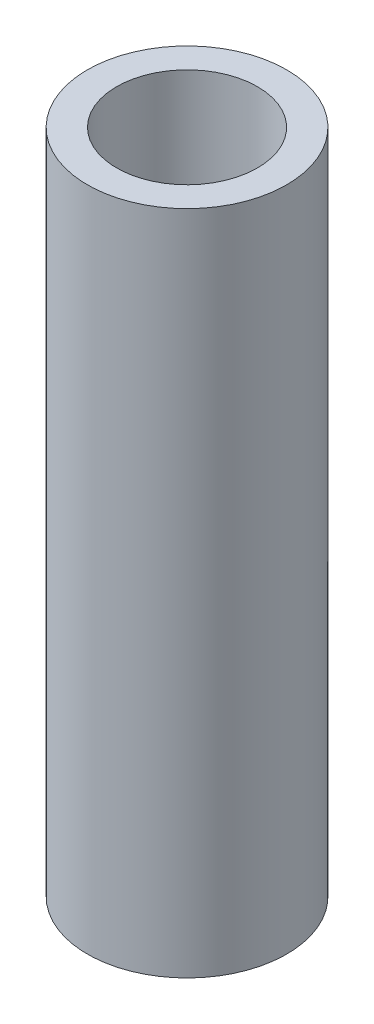
ISO-10303-21;
HEADER;
FILE_DESCRIPTION(('STEP AP214'),'2;1');
FILE_NAME('part.step','',(''),(''),'','','');
FILE_SCHEMA(('AUTOMOTIVE_DESIGN { 1 0 10303 214 1 1 1 1 }'));
ENDSEC;
DATA;
#1=APPLICATION_CONTEXT('core data for automotive mechanical design processes');
#2=APPLICATION_PROTOCOL_DEFINITION('international standard','automotive_design',2000,#1);
#3=PRODUCT_CONTEXT('',#1,'mechanical');
#4=PRODUCT('Part','Part','',(#3));
#5=PRODUCT_RELATED_PRODUCT_CATEGORY('part','',(#4));
#6=PRODUCT_DEFINITION_FORMATION('','',#4);
#7=PRODUCT_DEFINITION_CONTEXT('part definition',#1,'design');
#8=PRODUCT_DEFINITION('design','',#6,#7);
#9=PRODUCT_DEFINITION_SHAPE('','',#8);
#10=(LENGTH_UNIT() NAMED_UNIT(*) SI_UNIT(.MILLI.,.METRE.));
#11=(NAMED_UNIT(*) PLANE_ANGLE_UNIT() SI_UNIT($,.RADIAN.));
#12=(NAMED_UNIT(*) SI_UNIT($,.STERADIAN.) SOLID_ANGLE_UNIT());
#13=UNCERTAINTY_MEASURE_WITH_UNIT(LENGTH_MEASURE(1.E-05),#10,'distance_accuracy_value','');
#14=(GEOMETRIC_REPRESENTATION_CONTEXT(3) GLOBAL_UNCERTAINTY_ASSIGNED_CONTEXT((#13)) GLOBAL_UNIT_ASSIGNED_CONTEXT((#10,
#11,#12)) REPRESENTATION_CONTEXT('',''));
#15=CARTESIAN_POINT('',(0.,0.,0.));
#16=DIRECTION('',(0.,0.,1.));
#17=DIRECTION('',(1.,0.,0.));
#18=AXIS2_PLACEMENT_3D('',#15,#16,#17);
#19=CARTESIAN_POINT('',(0.,57.,0.));
#20=DIRECTION('',(0.,1.,0.));
#21=DIRECTION('',(0.,0.,1.));
#22=AXIS2_PLACEMENT_3D('',#19,#20,#21);
#23=PLANE('',#22);
#24=CARTESIAN_POINT('',(0.,57.,0.));
#25=DIRECTION('',(0.,1.,0.));
#26=DIRECTION('',(1.,0.,0.));
#27=AXIS2_PLACEMENT_3D('',#24,#25,#26);
#28=CIRCLE('',#27,8.525);
#29=CARTESIAN_POINT('',(0.,57.,-8.525));
#30=VERTEX_POINT('',#29);
#31=EDGE_CURVE('E11',#30,#30,#28,.T.);
#32=ORIENTED_EDGE('',*,*,#31,.T.);
#33=EDGE_LOOP('',(#32));
#34=FACE_BOUND('',#33,.T.);
#35=CARTESIAN_POINT('',(0.,57.,0.));
#36=DIRECTION('',(0.,1.,0.));
#37=DIRECTION('',(0.,0.,1.));
#38=AXIS2_PLACEMENT_3D('',#35,#36,#37);
#39=CIRCLE('',#38,6.025);
#40=CARTESIAN_POINT('',(0.,57.,-6.025));
#41=VERTEX_POINT('',#40);
#42=EDGE_CURVE('E62',#41,#41,#39,.T.);
#43=ORIENTED_EDGE('',*,*,#42,.F.);
#44=EDGE_LOOP('',(#43));
#45=FACE_BOUND('',#44,.T.);
#46=ADVANCED_FACE('F49',(#34,#45),#23,.T.);
#47=CARTESIAN_POINT('',(0.,0.,0.));
#48=DIRECTION('',(0.,1.,0.));
#49=DIRECTION('',(0.,0.,1.));
#50=AXIS2_PLACEMENT_3D('',#47,#48,#49);
#51=PLANE('',#50);
#52=CARTESIAN_POINT('',(0.,0.,0.));
#53=DIRECTION('',(0.,1.,0.));
#54=DIRECTION('',(1.,0.,0.));
#55=AXIS2_PLACEMENT_3D('',#52,#53,#54);
#56=CIRCLE('',#55,8.525);
#57=CARTESIAN_POINT('',(0.,0.,-8.525));
#58=VERTEX_POINT('',#57);
#59=EDGE_CURVE('E53',#58,#58,#56,.T.);
#60=ORIENTED_EDGE('',*,*,#59,.F.);
#61=EDGE_LOOP('',(#60));
#62=FACE_BOUND('',#61,.T.);
#63=CARTESIAN_POINT('',(0.,0.,0.));
#64=DIRECTION('',(0.,1.,0.));
#65=DIRECTION('',(0.,0.,1.));
#66=AXIS2_PLACEMENT_3D('',#63,#64,#65);
#67=CIRCLE('',#66,6.025);
#68=CARTESIAN_POINT('',(0.,0.,-6.025));
#69=VERTEX_POINT('',#68);
#70=EDGE_CURVE('E64',#69,#69,#67,.T.);
#71=ORIENTED_EDGE('',*,*,#70,.T.);
#72=EDGE_LOOP('',(#71));
#73=FACE_BOUND('',#72,.T.);
#74=ADVANCED_FACE('F76',(#62,#73),#51,.F.);
#75=CARTESIAN_POINT('',(0.,57.,0.));
#76=DIRECTION('',(0.,-1.,0.));
#77=DIRECTION('',(0.,0.,-1.));
#78=AXIS2_PLACEMENT_3D('',#75,#76,#77);
#79=CYLINDRICAL_SURFACE('',#78,8.525);
#80=CARTESIAN_POINT('',(0.,57.,-8.525));
#81=CARTESIAN_POINT('',(0.,56.40625,-8.525));
#82=CARTESIAN_POINT('',(0.,55.8125,-8.525));
#83=CARTESIAN_POINT('',(0.,54.625,-8.525));
#84=CARTESIAN_POINT('',(0.,54.03125,-8.525));
#85=CARTESIAN_POINT('',(0.,52.84375,-8.525));
#86=CARTESIAN_POINT('',(0.,52.25,-8.525));
#87=CARTESIAN_POINT('',(0.,51.0625,-8.525));
#88=CARTESIAN_POINT('',(0.,50.46875,-8.525));
#89=CARTESIAN_POINT('',(0.,49.28125,-8.525));
#90=CARTESIAN_POINT('',(0.,48.6875,-8.525));
#91=CARTESIAN_POINT('',(0.,47.5,-8.525));
#92=CARTESIAN_POINT('',(0.,46.90625,-8.525));
#93=CARTESIAN_POINT('',(0.,45.71875,-8.525));
#94=CARTESIAN_POINT('',(0.,45.125,-8.525));
#95=CARTESIAN_POINT('',(0.,43.9375,-8.525));
#96=CARTESIAN_POINT('',(0.,43.34375,-8.525));
#97=CARTESIAN_POINT('',(0.,42.15625,-8.525));
#98=CARTESIAN_POINT('',(0.,41.5625,-8.525));
#99=CARTESIAN_POINT('',(0.,40.375,-8.525));
#100=CARTESIAN_POINT('',(0.,39.78125,-8.525));
#101=CARTESIAN_POINT('',(0.,38.59375,-8.525));
#102=CARTESIAN_POINT('',(0.,38.,-8.525));
#103=CARTESIAN_POINT('',(0.,36.8125,-8.525));
#104=CARTESIAN_POINT('',(0.,36.21875,-8.525));
#105=CARTESIAN_POINT('',(0.,35.03125,-8.525));
#106=CARTESIAN_POINT('',(0.,34.4375,-8.525));
#107=CARTESIAN_POINT('',(0.,33.25,-8.525));
#108=CARTESIAN_POINT('',(0.,32.65625,-8.525));
#109=CARTESIAN_POINT('',(0.,31.46875,-8.525));
#110=CARTESIAN_POINT('',(0.,30.875,-8.525));
#111=CARTESIAN_POINT('',(0.,29.6875,-8.525));
#112=CARTESIAN_POINT('',(0.,29.09375,-8.525));
#113=CARTESIAN_POINT('',(0.,27.90625,-8.525));
#114=CARTESIAN_POINT('',(0.,27.3125,-8.525));
#115=CARTESIAN_POINT('',(0.,26.125,-8.525));
#116=CARTESIAN_POINT('',(0.,25.53125,-8.525));
#117=CARTESIAN_POINT('',(0.,24.34375,-8.525));
#118=CARTESIAN_POINT('',(0.,23.75,-8.525));
#119=CARTESIAN_POINT('',(0.,22.5625,-8.525));
#120=CARTESIAN_POINT('',(0.,21.96875,-8.525));
#121=CARTESIAN_POINT('',(0.,20.78125,-8.525));
#122=CARTESIAN_POINT('',(0.,20.1875,-8.525));
#123=CARTESIAN_POINT('',(0.,19.,-8.525));
#124=CARTESIAN_POINT('',(0.,18.40625,-8.525));
#125=CARTESIAN_POINT('',(0.,17.21875,-8.525));
#126=CARTESIAN_POINT('',(0.,16.625,-8.525));
#127=CARTESIAN_POINT('',(0.,15.4375,-8.525));
#128=CARTESIAN_POINT('',(0.,14.84375,-8.525));
#129=CARTESIAN_POINT('',(0.,13.65625,-8.525));
#130=CARTESIAN_POINT('',(0.,13.0625,-8.525));
#131=CARTESIAN_POINT('',(0.,11.875,-8.525));
#132=CARTESIAN_POINT('',(0.,11.28125,-8.525));
#133=CARTESIAN_POINT('',(0.,10.09375,-8.525));
#134=CARTESIAN_POINT('',(0.,9.5,-8.525));
#135=CARTESIAN_POINT('',(0.,8.3125,-8.525));
#136=CARTESIAN_POINT('',(0.,7.71875,-8.525));
#137=CARTESIAN_POINT('',(0.,6.53125,-8.525));
#138=CARTESIAN_POINT('',(0.,5.9375,-8.525));
#139=CARTESIAN_POINT('',(0.,4.75,-8.525));
#140=CARTESIAN_POINT('',(0.,4.15625,-8.525));
#141=CARTESIAN_POINT('',(0.,2.96875,-8.525));
#142=CARTESIAN_POINT('',(0.,2.375,-8.525));
#143=CARTESIAN_POINT('',(0.,1.1875,-8.525));
#144=CARTESIAN_POINT('',(0.,0.593749999999999,-8.525));
#145=CARTESIAN_POINT('',(0.,0.,-8.525));
#146=B_SPLINE_CURVE_WITH_KNOTS('',3,(#80,#81,#82,#83,#84,#85,#86,#87,#88,#89,#90,#91,#92,#93,
#94,#95,#96,#97,#98,#99,#100,#101,#102,#103,#104,#105,#106,#107,#108,#109,#110,#111,#112,#113,
#114,#115,#116,#117,#118,#119,#120,#121,#122,#123,#124,#125,#126,#127,#128,#129,#130,#131,#132,
#133,#134,#135,#136,#137,#138,#139,#140,#141,#142,#143,#144,#145),.UNSPECIFIED.,.F.,.F.,(4,2,2,
2,2,2,2,2,2,2,2,2,2,2,2,2,2,2,2,2,2,2,2,2,2,2,2,2,2,2,2,2,4),(0.,1.78125,3.5625,
5.34374999999999,7.12499999999999,8.90625,10.6875,12.46875,14.25,16.03125,17.8125,19.59375,
21.375,23.15625,24.9375,26.71875,28.5,30.28125,32.0625,33.84375,35.625,37.40625,39.1875,
40.96875,42.75,44.53125,46.3125,48.09375,49.875,51.65625,53.4375,55.21875,57.),.UNSPECIFIED.);
#147=EDGE_CURVE('BSEAM51',#30,#58,#146,.T.);
#148=ORIENTED_EDGE('',*,*,#31,.F.);
#149=ORIENTED_EDGE('',*,*,#59,.T.);
#150=ORIENTED_EDGE('',*,*,#147,.T.);
#151=ORIENTED_EDGE('',*,*,#147,.F.);
#152=EDGE_LOOP('',(#148,#150,#149,#151));
#153=FACE_BOUND('',#152,.T.);
#154=ADVANCED_FACE('F51',(#153),#79,.T.);
#155=CARTESIAN_POINT('',(0.,57.,0.));
#156=DIRECTION('',(0.,-1.,0.));
#157=DIRECTION('',(0.,0.,-1.));
#158=AXIS2_PLACEMENT_3D('',#155,#156,#157);
#159=CYLINDRICAL_SURFACE('',#158,6.025);
#160=CARTESIAN_POINT('',(0.,57.,-6.025));
#161=CARTESIAN_POINT('',(0.,56.40625,-6.025));
#162=CARTESIAN_POINT('',(0.,55.8125,-6.025));
#163=CARTESIAN_POINT('',(0.,54.625,-6.025));
#164=CARTESIAN_POINT('',(0.,54.03125,-6.025));
#165=CARTESIAN_POINT('',(0.,52.84375,-6.025));
#166=CARTESIAN_POINT('',(0.,52.25,-6.025));
#167=CARTESIAN_POINT('',(0.,51.0625,-6.025));
#168=CARTESIAN_POINT('',(0.,50.46875,-6.025));
#169=CARTESIAN_POINT('',(0.,49.28125,-6.025));
#170=CARTESIAN_POINT('',(0.,48.6875,-6.025));
#171=CARTESIAN_POINT('',(0.,47.5,-6.025));
#172=CARTESIAN_POINT('',(0.,46.90625,-6.025));
#173=CARTESIAN_POINT('',(0.,45.71875,-6.025));
#174=CARTESIAN_POINT('',(0.,45.125,-6.025));
#175=CARTESIAN_POINT('',(0.,43.9375,-6.025));
#176=CARTESIAN_POINT('',(0.,43.34375,-6.025));
#177=CARTESIAN_POINT('',(0.,42.15625,-6.025));
#178=CARTESIAN_POINT('',(0.,41.5625,-6.025));
#179=CARTESIAN_POINT('',(0.,40.375,-6.025));
#180=CARTESIAN_POINT('',(0.,39.78125,-6.025));
#181=CARTESIAN_POINT('',(0.,38.59375,-6.025));
#182=CARTESIAN_POINT('',(0.,38.,-6.025));
#183=CARTESIAN_POINT('',(0.,36.8125,-6.025));
#184=CARTESIAN_POINT('',(0.,36.21875,-6.025));
#185=CARTESIAN_POINT('',(0.,35.03125,-6.025));
#186=CARTESIAN_POINT('',(0.,34.4375,-6.025));
#187=CARTESIAN_POINT('',(0.,33.25,-6.025));
#188=CARTESIAN_POINT('',(0.,32.65625,-6.025));
#189=CARTESIAN_POINT('',(0.,31.46875,-6.025));
#190=CARTESIAN_POINT('',(0.,30.875,-6.025));
#191=CARTESIAN_POINT('',(0.,29.6875,-6.025));
#192=CARTESIAN_POINT('',(0.,29.09375,-6.025));
#193=CARTESIAN_POINT('',(0.,27.90625,-6.025));
#194=CARTESIAN_POINT('',(0.,27.3125,-6.025));
#195=CARTESIAN_POINT('',(0.,26.125,-6.025));
#196=CARTESIAN_POINT('',(0.,25.53125,-6.025));
#197=CARTESIAN_POINT('',(0.,24.34375,-6.025));
#198=CARTESIAN_POINT('',(0.,23.75,-6.025));
#199=CARTESIAN_POINT('',(0.,22.5625,-6.025));
#200=CARTESIAN_POINT('',(0.,21.96875,-6.025));
#201=CARTESIAN_POINT('',(0.,20.78125,-6.025));
#202=CARTESIAN_POINT('',(0.,20.1875,-6.025));
#203=CARTESIAN_POINT('',(0.,19.,-6.025));
#204=CARTESIAN_POINT('',(0.,18.40625,-6.025));
#205=CARTESIAN_POINT('',(0.,17.21875,-6.025));
#206=CARTESIAN_POINT('',(0.,16.625,-6.025));
#207=CARTESIAN_POINT('',(0.,15.4375,-6.025));
#208=CARTESIAN_POINT('',(0.,14.84375,-6.025));
#209=CARTESIAN_POINT('',(0.,13.65625,-6.025));
#210=CARTESIAN_POINT('',(0.,13.0625,-6.025));
#211=CARTESIAN_POINT('',(0.,11.875,-6.025));
#212=CARTESIAN_POINT('',(0.,11.28125,-6.025));
#213=CARTESIAN_POINT('',(0.,10.09375,-6.025));
#214=CARTESIAN_POINT('',(0.,9.5,-6.025));
#215=CARTESIAN_POINT('',(0.,8.3125,-6.025));
#216=CARTESIAN_POINT('',(0.,7.71875,-6.025));
#217=CARTESIAN_POINT('',(0.,6.53125,-6.025));
#218=CARTESIAN_POINT('',(0.,5.9375,-6.025));
#219=CARTESIAN_POINT('',(0.,4.75,-6.025));
#220=CARTESIAN_POINT('',(0.,4.15625,-6.025));
#221=CARTESIAN_POINT('',(0.,2.96875,-6.025));
#222=CARTESIAN_POINT('',(0.,2.375,-6.025));
#223=CARTESIAN_POINT('',(0.,1.1875,-6.025));
#224=CARTESIAN_POINT('',(0.,0.593749999999999,-6.025));
#225=CARTESIAN_POINT('',(0.,0.,-6.025));
#226=B_SPLINE_CURVE_WITH_KNOTS('',3,(#160,#161,#162,#163,#164,#165,#166,#167,#168,#169,#170,
#171,#172,#173,#174,#175,#176,#177,#178,#179,#180,#181,#182,#183,#184,#185,#186,#187,#188,#189,
#190,#191,#192,#193,#194,#195,#196,#197,#198,#199,#200,#201,#202,#203,#204,#205,#206,#207,#208,
#209,#210,#211,#212,#213,#214,#215,#216,#217,#218,#219,#220,#221,#222,#223,#224,#225),
.UNSPECIFIED.,.F.,.F.,(4,2,2,2,2,2,2,2,2,2,2,2,2,2,2,2,2,2,2,2,2,2,2,2,2,2,2,2,2,2,2,2,4),(0.,
1.78125,3.5625,5.34374999999999,7.12499999999999,8.90625,10.6875,12.46875,14.25,16.03125,
17.8125,19.59375,21.375,23.15625,24.9375,26.71875,28.5,30.28125,32.0625,33.84375,35.625,
37.40625,39.1875,40.96875,42.75,44.53125,46.3125,48.09375,49.875,51.65625,53.4375,55.21875,57.),.UNSPECIFIED.);
#227=EDGE_CURVE('BSEAM72',#41,#69,#226,.T.);
#228=ORIENTED_EDGE('',*,*,#42,.T.);
#229=ORIENTED_EDGE('',*,*,#70,.F.);
#230=ORIENTED_EDGE('',*,*,#227,.T.);
#231=ORIENTED_EDGE('',*,*,#227,.F.);
#232=EDGE_LOOP('',(#228,#230,#229,#231));
#233=FACE_BOUND('',#232,.T.);
#234=ADVANCED_FACE('F72',(#233),#159,.F.);
#235=CLOSED_SHELL('',(#46,#74,#154,#234));
#236=MANIFOLD_SOLID_BREP('B2',#235);
#237=ADVANCED_BREP_SHAPE_REPRESENTATION('',(#18,#236),#14);
#238=SHAPE_DEFINITION_REPRESENTATION(#9,#237);
ENDSEC;
END-ISO-10303-21;
